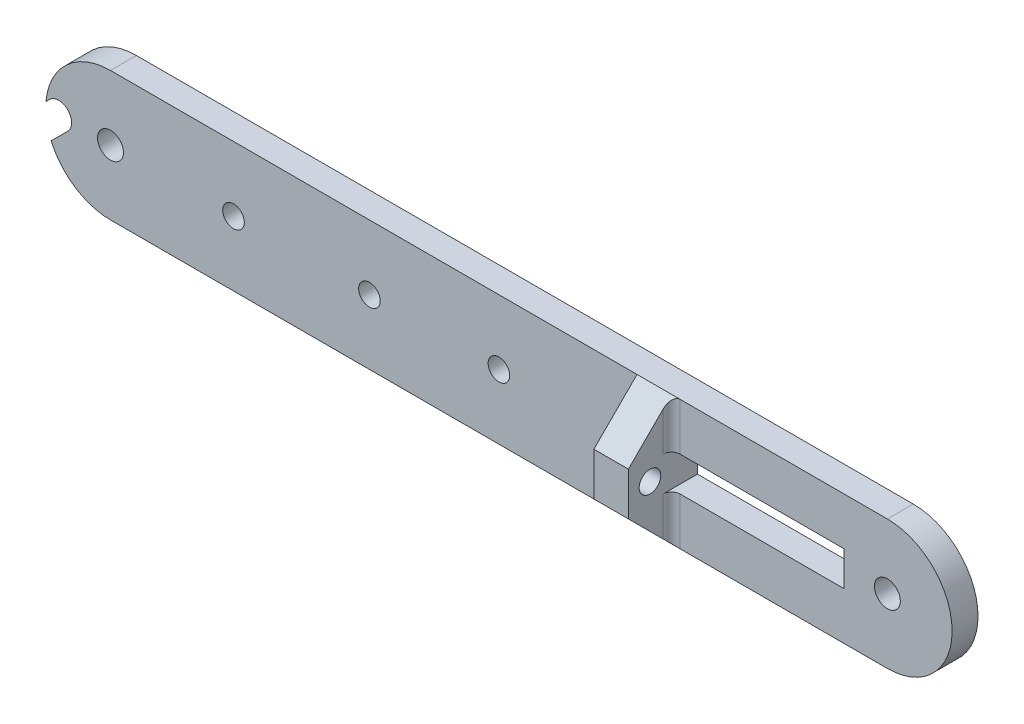
ISO-10303-21;
HEADER;
FILE_DESCRIPTION(('STEP AP214'),'2;1');
FILE_NAME('part.step','',(''),(''),'','','');
FILE_SCHEMA(('AUTOMOTIVE_DESIGN { 1 0 10303 214 1 1 1 1 }'));
ENDSEC;
DATA;
#1=APPLICATION_CONTEXT('core data for automotive mechanical design processes');
#2=APPLICATION_PROTOCOL_DEFINITION('international standard','automotive_design',2000,#1);
#3=PRODUCT_CONTEXT('',#1,'mechanical');
#4=PRODUCT('Part','Part','',(#3));
#5=PRODUCT_RELATED_PRODUCT_CATEGORY('part','',(#4));
#6=PRODUCT_DEFINITION_FORMATION('','',#4);
#7=PRODUCT_DEFINITION_CONTEXT('part definition',#1,'design');
#8=PRODUCT_DEFINITION('design','',#6,#7);
#9=PRODUCT_DEFINITION_SHAPE('','',#8);
#10=(LENGTH_UNIT() NAMED_UNIT(*) SI_UNIT(.MILLI.,.METRE.));
#11=(NAMED_UNIT(*) PLANE_ANGLE_UNIT() SI_UNIT($,.RADIAN.));
#12=(NAMED_UNIT(*) SI_UNIT($,.STERADIAN.) SOLID_ANGLE_UNIT());
#13=UNCERTAINTY_MEASURE_WITH_UNIT(LENGTH_MEASURE(1.E-05),#10,'distance_accuracy_value','');
#14=(GEOMETRIC_REPRESENTATION_CONTEXT(3) GLOBAL_UNCERTAINTY_ASSIGNED_CONTEXT((#13)) GLOBAL_UNIT_ASSIGNED_CONTEXT((#10,
#11,#12)) REPRESENTATION_CONTEXT('',''));
#15=CARTESIAN_POINT('',(0.,0.,0.));
#16=DIRECTION('',(0.,0.,1.));
#17=DIRECTION('',(1.,0.,0.));
#18=AXIS2_PLACEMENT_3D('',#15,#16,#17);
#19=CARTESIAN_POINT('',(90.,0.,6.));
#20=DIRECTION('',(0.,0.,1.));
#21=DIRECTION('',(1.,0.,0.));
#22=AXIS2_PLACEMENT_3D('',#19,#20,#21);
#23=PLANE('',#22);
#24=CARTESIAN_POINT('',(-30.,0.,6.));
#25=DIRECTION('',(0.,0.,1.));
#26=DIRECTION('',(1.,0.,0.));
#27=AXIS2_PLACEMENT_3D('',#24,#25,#26);
#28=CIRCLE('',#27,2.5);
#29=CARTESIAN_POINT('',(-27.5,0.,6.));
#30=VERTEX_POINT('',#29);
#31=EDGE_CURVE('E381',#30,#30,#28,.T.);
#32=ORIENTED_EDGE('',*,*,#31,.F.);
#33=EDGE_LOOP('',(#32));
#34=FACE_BOUND('',#33,.T.);
#35=CARTESIAN_POINT('',(-90.,0.,6.));
#36=DIRECTION('',(0.,0.,1.));
#37=DIRECTION('',(-1.,0.,0.));
#38=AXIS2_PLACEMENT_3D('',#35,#36,#37);
#39=CIRCLE('',#38,3.00000000000001);
#40=CARTESIAN_POINT('',(-93.,0.,6.));
#41=VERTEX_POINT('',#40);
#42=EDGE_CURVE('E393',#41,#41,#39,.T.);
#43=ORIENTED_EDGE('',*,*,#42,.F.);
#44=EDGE_LOOP('',(#43));
#45=FACE_BOUND('',#44,.T.);
#46=CARTESIAN_POINT('',(0.,0.,6.));
#47=DIRECTION('',(0.,0.,1.));
#48=DIRECTION('',(1.,0.,0.));
#49=AXIS2_PLACEMENT_3D('',#46,#47,#48);
#50=CIRCLE('',#49,2.5);
#51=CARTESIAN_POINT('',(2.5,0.,6.));
#52=VERTEX_POINT('',#51);
#53=EDGE_CURVE('E424',#52,#52,#50,.T.);
#54=ORIENTED_EDGE('',*,*,#53,.F.);
#55=EDGE_LOOP('',(#54));
#56=FACE_BOUND('',#55,.T.);
#57=CARTESIAN_POINT('',(-61.5,0.,6.));
#58=DIRECTION('',(0.,0.,1.));
#59=DIRECTION('',(1.,0.,0.));
#60=AXIS2_PLACEMENT_3D('',#57,#58,#59);
#61=CIRCLE('',#60,2.50000000000001);
#62=CARTESIAN_POINT('',(-59.,0.,6.));
#63=VERTEX_POINT('',#62);
#64=EDGE_CURVE('E387',#63,#63,#61,.T.);
#65=ORIENTED_EDGE('',*,*,#64,.F.);
#66=EDGE_LOOP('',(#65));
#67=FACE_BOUND('',#66,.T.);
#68=CARTESIAN_POINT('',(-102.,0.,6.));
#69=DIRECTION('',(0.,0.,1.));
#70=DIRECTION('',(1.,0.,0.));
#71=AXIS2_PLACEMENT_3D('',#68,#69,#70);
#72=CIRCLE('',#71,3.00000000000001);
#73=CARTESIAN_POINT('',(-99.8786796564403,-2.12132034355963,6.));
#74=VERTEX_POINT('',#73);
#75=CARTESIAN_POINT('',(-104.12132034356,2.12132034355962,6.));
#76=VERTEX_POINT('',#75);
#77=EDGE_CURVE('E199',#74,#76,#72,.T.);
#78=ORIENTED_EDGE('',*,*,#77,.F.);
#79=DIRECTION('',(-0.707106781186543,-0.707106781186552,0.));
#80=VECTOR('',#79,1.);
#81=CARTESIAN_POINT('',(-48.878679656441,48.8786796564403,6.));
#82=LINE('',#81,#80);
#83=CARTESIAN_POINT('',(-103.750652312537,-5.99329299965612,6.));
#84=VERTEX_POINT('',#83);
#85=EDGE_CURVE('E205',#74,#84,#82,.T.);
#86=ORIENTED_EDGE('',*,*,#85,.T.);
#87=CARTESIAN_POINT('',(-90.,0.,6.));
#88=DIRECTION('',(0.,0.,1.));
#89=DIRECTION('',(-1.,0.,0.));
#90=AXIS2_PLACEMENT_3D('',#87,#88,#89);
#91=CIRCLE('',#90,15.);
#92=CARTESIAN_POINT('',(-90.,-15.,6.));
#93=VERTEX_POINT('',#92);
#94=EDGE_CURVE('E349',#84,#93,#91,.T.);
#95=ORIENTED_EDGE('',*,*,#94,.T.);
#96=DIRECTION('',(1.,0.,0.));
#97=VECTOR('',#96,1.);
#98=CARTESIAN_POINT('',(90.,-15.,6.));
#99=LINE('',#98,#97);
#100=CARTESIAN_POINT('',(32.,-15.,6.));
#101=VERTEX_POINT('',#100);
#102=EDGE_CURVE('E351',#93,#101,#99,.T.);
#103=ORIENTED_EDGE('',*,*,#102,.T.);
#104=DIRECTION('',(0.,1.,0.));
#105=VECTOR('',#104,1.);
#106=CARTESIAN_POINT('',(32.,-15.,6.));
#107=LINE('',#106,#105);
#108=CARTESIAN_POINT('',(32.,15.,6.));
#109=VERTEX_POINT('',#108);
#110=EDGE_CURVE('E277',#101,#109,#107,.T.);
#111=ORIENTED_EDGE('',*,*,#110,.T.);
#112=DIRECTION('',(-1.,0.,0.));
#113=VECTOR('',#112,1.);
#114=CARTESIAN_POINT('',(90.,15.,6.));
#115=LINE('',#114,#113);
#116=CARTESIAN_POINT('',(-90.,15.,6.));
#117=VERTEX_POINT('',#116);
#118=EDGE_CURVE('E347',#109,#117,#115,.T.);
#119=ORIENTED_EDGE('',*,*,#118,.T.);
#120=CARTESIAN_POINT('',(-104.943648089812,1.29899259730734,6.));
#121=VERTEX_POINT('',#120);
#122=EDGE_CURVE('E343',#117,#121,#91,.T.);
#123=ORIENTED_EDGE('',*,*,#122,.T.);
#124=DIRECTION('',(-0.707106781186544,-0.707106781186552,0.));
#125=VECTOR('',#124,1.);
#126=CARTESIAN_POINT('',(-53.1213203435602,53.1213203435596,6.));
#127=LINE('',#126,#125);
#128=EDGE_CURVE('E48',#76,#121,#127,.T.);
#129=ORIENTED_EDGE('',*,*,#128,.F.);
#130=EDGE_LOOP('',(#78,#86,#95,#103,#111,#119,#123,#129));
#131=FACE_BOUND('',#130,.T.);
#132=ADVANCED_FACE('F33',(#34,#45,#56,#67,#131),#23,.T.);
#133=CARTESIAN_POINT('',(90.,0.,0.));
#134=DIRECTION('',(0.,0.,1.));
#135=DIRECTION('',(1.,0.,0.));
#136=AXIS2_PLACEMENT_3D('',#133,#134,#135);
#137=PLANE('',#136);
#138=CARTESIAN_POINT('',(-30.,0.,0.));
#139=DIRECTION('',(0.,0.,1.));
#140=DIRECTION('',(1.,0.,0.));
#141=AXIS2_PLACEMENT_3D('',#138,#139,#140);
#142=CIRCLE('',#141,2.5);
#143=CARTESIAN_POINT('',(-27.5,0.,0.));
#144=VERTEX_POINT('',#143);
#145=EDGE_CURVE('E287',#144,#144,#142,.T.);
#146=ORIENTED_EDGE('',*,*,#145,.T.);
#147=EDGE_LOOP('',(#146));
#148=FACE_BOUND('',#147,.T.);
#149=CARTESIAN_POINT('',(-61.5,0.,0.));
#150=DIRECTION('',(0.,0.,1.));
#151=DIRECTION('',(1.,0.,0.));
#152=AXIS2_PLACEMENT_3D('',#149,#150,#151);
#153=CIRCLE('',#152,2.50000000000001);
#154=CARTESIAN_POINT('',(-59.,0.,0.));
#155=VERTEX_POINT('',#154);
#156=EDGE_CURVE('E384',#155,#155,#153,.T.);
#157=ORIENTED_EDGE('',*,*,#156,.T.);
#158=EDGE_LOOP('',(#157));
#159=FACE_BOUND('',#158,.T.);
#160=CARTESIAN_POINT('',(-90.,0.,0.));
#161=DIRECTION('',(0.,0.,1.));
#162=DIRECTION('',(-1.,0.,0.));
#163=AXIS2_PLACEMENT_3D('',#160,#161,#162);
#164=CIRCLE('',#163,3.00000000000001);
#165=CARTESIAN_POINT('',(-93.,0.,0.));
#166=VERTEX_POINT('',#165);
#167=EDGE_CURVE('E390',#166,#166,#164,.T.);
#168=ORIENTED_EDGE('',*,*,#167,.T.);
#169=EDGE_LOOP('',(#168));
#170=FACE_BOUND('',#169,.T.);
#171=DIRECTION('',(0.,1.,0.));
#172=VECTOR('',#171,1.);
#173=CARTESIAN_POINT('',(80.,-4.,0.));
#174=LINE('',#173,#172);
#175=CARTESIAN_POINT('',(80.,-4.,0.));
#176=VERTEX_POINT('',#175);
#177=CARTESIAN_POINT('',(80.,4.,0.));
#178=VERTEX_POINT('',#177);
#179=EDGE_CURVE('E396',#176,#178,#174,.T.);
#180=ORIENTED_EDGE('',*,*,#179,.T.);
#181=DIRECTION('',(-1.,0.,0.));
#182=VECTOR('',#181,1.);
#183=CARTESIAN_POINT('',(40.,4.,0.));
#184=LINE('',#183,#182);
#185=CARTESIAN_POINT('',(40.,4.,0.));
#186=VERTEX_POINT('',#185);
#187=EDGE_CURVE('E404',#178,#186,#184,.T.);
#188=ORIENTED_EDGE('',*,*,#187,.T.);
#189=DIRECTION('',(0.,-1.,0.));
#190=VECTOR('',#189,1.);
#191=CARTESIAN_POINT('',(40.,-4.,0.));
#192=LINE('',#191,#190);
#193=CARTESIAN_POINT('',(40.,-4.,0.));
#194=VERTEX_POINT('',#193);
#195=EDGE_CURVE('E407',#186,#194,#192,.T.);
#196=ORIENTED_EDGE('',*,*,#195,.T.);
#197=DIRECTION('',(1.,0.,0.));
#198=VECTOR('',#197,1.);
#199=CARTESIAN_POINT('',(40.,-4.,0.));
#200=LINE('',#199,#198);
#201=EDGE_CURVE('E401',#194,#176,#200,.T.);
#202=ORIENTED_EDGE('',*,*,#201,.T.);
#203=EDGE_LOOP('',(#180,#188,#196,#202));
#204=FACE_BOUND('',#203,.T.);
#205=CARTESIAN_POINT('',(0.,0.,0.));
#206=DIRECTION('',(0.,0.,1.));
#207=DIRECTION('',(1.,0.,0.));
#208=AXIS2_PLACEMENT_3D('',#205,#206,#207);
#209=CIRCLE('',#208,2.5);
#210=CARTESIAN_POINT('',(2.5,0.,0.));
#211=VERTEX_POINT('',#210);
#212=EDGE_CURVE('E421',#211,#211,#209,.T.);
#213=ORIENTED_EDGE('',*,*,#212,.T.);
#214=EDGE_LOOP('',(#213));
#215=FACE_BOUND('',#214,.T.);
#216=CARTESIAN_POINT('',(90.,0.,0.));
#217=DIRECTION('',(0.,0.,1.));
#218=DIRECTION('',(1.,0.,0.));
#219=AXIS2_PLACEMENT_3D('',#216,#217,#218);
#220=CIRCLE('',#219,3.00000000000001);
#221=CARTESIAN_POINT('',(93.,0.,0.));
#222=VERTEX_POINT('',#221);
#223=EDGE_CURVE('E417',#222,#222,#220,.T.);
#224=ORIENTED_EDGE('',*,*,#223,.T.);
#225=EDGE_LOOP('',(#224));
#226=FACE_BOUND('',#225,.T.);
#227=DIRECTION('',(-0.707106781186543,-0.707106781186552,0.));
#228=VECTOR('',#227,1.);
#229=CARTESIAN_POINT('',(-3.87867965644158,93.8786796564403,0.));
#230=LINE('',#229,#228);
#231=CARTESIAN_POINT('',(-99.8786796564403,-2.12132034355963,0.));
#232=VERTEX_POINT('',#231);
#233=CARTESIAN_POINT('',(-103.750652312537,-5.99329299965612,0.));
#234=VERTEX_POINT('',#233);
#235=EDGE_CURVE('E219',#232,#234,#230,.T.);
#236=ORIENTED_EDGE('',*,*,#235,.F.);
#237=CARTESIAN_POINT('',(-102.,0.,0.));
#238=DIRECTION('',(0.,0.,1.));
#239=DIRECTION('',(1.,0.,0.));
#240=AXIS2_PLACEMENT_3D('',#237,#238,#239);
#241=CIRCLE('',#240,3.00000000000001);
#242=CARTESIAN_POINT('',(-104.12132034356,2.12132034355962,0.));
#243=VERTEX_POINT('',#242);
#244=EDGE_CURVE('E11',#232,#243,#241,.T.);
#245=ORIENTED_EDGE('',*,*,#244,.T.);
#246=DIRECTION('',(-0.707106781186544,-0.707106781186552,0.));
#247=VECTOR('',#246,1.);
#248=CARTESIAN_POINT('',(-8.12132034356074,98.1213203435596,0.));
#249=LINE('',#248,#247);
#250=CARTESIAN_POINT('',(-104.943648089812,1.29899259730734,0.));
#251=VERTEX_POINT('',#250);
#252=EDGE_CURVE('E215',#243,#251,#249,.T.);
#253=ORIENTED_EDGE('',*,*,#252,.T.);
#254=CARTESIAN_POINT('',(-90.,0.,0.));
#255=DIRECTION('',(0.,0.,1.));
#256=DIRECTION('',(-1.,0.,0.));
#257=AXIS2_PLACEMENT_3D('',#254,#255,#256);
#258=CIRCLE('',#257,15.);
#259=CARTESIAN_POINT('',(-90.,15.,0.));
#260=VERTEX_POINT('',#259);
#261=EDGE_CURVE('E345',#260,#251,#258,.T.);
#262=ORIENTED_EDGE('',*,*,#261,.F.);
#263=DIRECTION('',(-1.,0.,0.));
#264=VECTOR('',#263,1.);
#265=CARTESIAN_POINT('',(90.,15.,0.));
#266=LINE('',#265,#264);
#267=CARTESIAN_POINT('',(90.,15.,0.));
#268=VERTEX_POINT('',#267);
#269=EDGE_CURVE('E495',#268,#260,#266,.T.);
#270=ORIENTED_EDGE('',*,*,#269,.F.);
#271=CARTESIAN_POINT('',(90.,0.,0.));
#272=DIRECTION('',(0.,0.,1.));
#273=DIRECTION('',(1.,0.,0.));
#274=AXIS2_PLACEMENT_3D('',#271,#272,#273);
#275=CIRCLE('',#274,15.);
#276=CARTESIAN_POINT('',(90.,-15.,0.));
#277=VERTEX_POINT('',#276);
#278=EDGE_CURVE('E358',#277,#268,#275,.T.);
#279=ORIENTED_EDGE('',*,*,#278,.F.);
#280=DIRECTION('',(1.,0.,0.));
#281=VECTOR('',#280,1.);
#282=CARTESIAN_POINT('',(90.,-15.,0.));
#283=LINE('',#282,#281);
#284=CARTESIAN_POINT('',(-90.,-15.,0.));
#285=VERTEX_POINT('',#284);
#286=EDGE_CURVE('E430',#285,#277,#283,.T.);
#287=ORIENTED_EDGE('',*,*,#286,.F.);
#288=EDGE_CURVE('E440',#234,#285,#258,.T.);
#289=ORIENTED_EDGE('',*,*,#288,.F.);
#290=EDGE_LOOP('',(#236,#245,#253,#262,#270,#279,#287,#289));
#291=FACE_BOUND('',#290,.T.);
#292=ADVANCED_FACE('F476',(#148,#159,#170,#204,#215,#226,#291),#137,.F.);
#293=CARTESIAN_POINT('',(-90.,0.,6.));
#294=DIRECTION('',(0.,0.,-1.));
#295=DIRECTION('',(-1.,0.,0.));
#296=AXIS2_PLACEMENT_3D('',#293,#294,#295);
#297=CYLINDRICAL_SURFACE('',#296,15.);
#298=DIRECTION('',(0.,0.,-1.));
#299=VECTOR('',#298,1.);
#300=CARTESIAN_POINT('',(-103.750652312537,-5.99329299965612,6.));
#301=LINE('',#300,#299);
#302=EDGE_CURVE('E41',#234,#84,#301,.F.);
#303=ORIENTED_EDGE('',*,*,#302,.F.);
#304=ORIENTED_EDGE('',*,*,#288,.T.);
#305=DIRECTION('',(0.,0.,-1.));
#306=VECTOR('',#305,1.);
#307=CARTESIAN_POINT('',(-90.,-15.,6.));
#308=LINE('',#307,#306);
#309=EDGE_CURVE('E444',#93,#285,#308,.T.);
#310=ORIENTED_EDGE('',*,*,#309,.F.);
#311=ORIENTED_EDGE('',*,*,#94,.F.);
#312=EDGE_LOOP('',(#303,#304,#310,#311));
#313=FACE_BOUND('',#312,.T.);
#314=ADVANCED_FACE('F511',(#313),#297,.T.);
#315=CARTESIAN_POINT('',(90.,15.,6.));
#316=VERTEX_POINT('',#315);
#317=CARTESIAN_POINT('',(42.,15.,6.));
#318=VERTEX_POINT('',#317);
#319=EDGE_CURVE('E352',#316,#318,#115,.T.);
#320=ORIENTED_EDGE('',*,*,#319,.T.);
#321=DIRECTION('',(0.,1.,0.));
#322=VECTOR('',#321,1.);
#323=CARTESIAN_POINT('',(42.,4.,6.));
#324=LINE('',#323,#322);
#325=CARTESIAN_POINT('',(42.,4.,6.));
#326=VERTEX_POINT('',#325);
#327=EDGE_CURVE('E322',#318,#326,#324,.F.);
#328=ORIENTED_EDGE('',*,*,#327,.T.);
#329=DIRECTION('',(-1.,0.,0.));
#330=VECTOR('',#329,1.);
#331=CARTESIAN_POINT('',(40.,4.,6.));
#332=LINE('',#331,#330);
#333=CARTESIAN_POINT('',(80.,4.,6.));
#334=VERTEX_POINT('',#333);
#335=EDGE_CURVE('E310',#334,#326,#332,.T.);
#336=ORIENTED_EDGE('',*,*,#335,.F.);
#337=DIRECTION('',(0.,1.,0.));
#338=VECTOR('',#337,1.);
#339=CARTESIAN_POINT('',(80.,-4.,6.));
#340=LINE('',#339,#338);
#341=CARTESIAN_POINT('',(80.,-4.,6.));
#342=VERTEX_POINT('',#341);
#343=EDGE_CURVE('E399',#342,#334,#340,.T.);
#344=ORIENTED_EDGE('',*,*,#343,.F.);
#345=DIRECTION('',(1.,0.,0.));
#346=VECTOR('',#345,1.);
#347=CARTESIAN_POINT('',(40.,-4.,6.));
#348=LINE('',#347,#346);
#349=CARTESIAN_POINT('',(42.,-4.,6.));
#350=VERTEX_POINT('',#349);
#351=EDGE_CURVE('E313',#350,#342,#348,.T.);
#352=ORIENTED_EDGE('',*,*,#351,.F.);
#353=DIRECTION('',(0.,1.,0.));
#354=VECTOR('',#353,1.);
#355=CARTESIAN_POINT('',(42.,-15.,6.));
#356=LINE('',#355,#354);
#357=CARTESIAN_POINT('',(42.,-15.,6.));
#358=VERTEX_POINT('',#357);
#359=EDGE_CURVE('E319',#350,#358,#356,.F.);
#360=ORIENTED_EDGE('',*,*,#359,.T.);
#361=CARTESIAN_POINT('',(90.,-15.,6.));
#362=VERTEX_POINT('',#361);
#363=EDGE_CURVE('E316',#358,#362,#99,.T.);
#364=ORIENTED_EDGE('',*,*,#363,.T.);
#365=CARTESIAN_POINT('',(90.,0.,6.));
#366=DIRECTION('',(0.,0.,1.));
#367=DIRECTION('',(1.,0.,0.));
#368=AXIS2_PLACEMENT_3D('',#365,#366,#367);
#369=CIRCLE('',#368,15.);
#370=EDGE_CURVE('E428',#362,#316,#369,.T.);
#371=ORIENTED_EDGE('',*,*,#370,.T.);
#372=EDGE_LOOP('',(#320,#328,#336,#344,#352,#360,#364,#371));
#373=FACE_BOUND('',#372,.T.);
#374=CARTESIAN_POINT('',(90.,0.,6.));
#375=DIRECTION('',(0.,0.,1.));
#376=DIRECTION('',(1.,0.,0.));
#377=AXIS2_PLACEMENT_3D('',#374,#375,#376);
#378=CIRCLE('',#377,3.00000000000001);
#379=CARTESIAN_POINT('',(93.,0.,6.));
#380=VERTEX_POINT('',#379);
#381=EDGE_CURVE('E418',#380,#380,#378,.T.);
#382=ORIENTED_EDGE('',*,*,#381,.F.);
#383=EDGE_LOOP('',(#382));
#384=FACE_BOUND('',#383,.T.);
#385=ADVANCED_FACE('F451',(#373,#384),#23,.T.);
#386=CARTESIAN_POINT('',(90.,0.,6.));
#387=DIRECTION('',(0.,0.,-1.));
#388=DIRECTION('',(-1.,0.,0.));
#389=AXIS2_PLACEMENT_3D('',#386,#387,#388);
#390=CYLINDRICAL_SURFACE('',#389,15.);
#391=ORIENTED_EDGE('',*,*,#278,.T.);
#392=DIRECTION('',(0.,0.,-1.));
#393=VECTOR('',#392,1.);
#394=CARTESIAN_POINT('',(90.,15.,6.));
#395=LINE('',#394,#393);
#396=EDGE_CURVE('E448',#316,#268,#395,.T.);
#397=ORIENTED_EDGE('',*,*,#396,.F.);
#398=ORIENTED_EDGE('',*,*,#370,.F.);
#399=DIRECTION('',(0.,0.,-1.));
#400=VECTOR('',#399,1.);
#401=CARTESIAN_POINT('',(90.,-15.,6.));
#402=LINE('',#401,#400);
#403=EDGE_CURVE('E365',#362,#277,#402,.T.);
#404=ORIENTED_EDGE('',*,*,#403,.T.);
#405=EDGE_LOOP('',(#391,#397,#398,#404));
#406=FACE_BOUND('',#405,.T.);
#407=ADVANCED_FACE('F493',(#406),#390,.T.);
#408=CARTESIAN_POINT('',(90.,15.,6.));
#409=DIRECTION('',(0.,-1.,0.));
#410=DIRECTION('',(0.,0.,-1.));
#411=AXIS2_PLACEMENT_3D('',#408,#409,#410);
#412=PLANE('',#411);
#413=ORIENTED_EDGE('',*,*,#269,.T.);
#414=DIRECTION('',(0.,0.,-1.));
#415=VECTOR('',#414,1.);
#416=CARTESIAN_POINT('',(-90.,15.,6.));
#417=LINE('',#416,#415);
#418=EDGE_CURVE('E446',#117,#260,#417,.T.);
#419=ORIENTED_EDGE('',*,*,#418,.F.);
#420=ORIENTED_EDGE('',*,*,#118,.F.);
#421=DIRECTION('',(1.,0.,0.));
#422=VECTOR('',#421,1.);
#423=CARTESIAN_POINT('',(32.,15.,6.));
#424=LINE('',#423,#422);
#425=EDGE_CURVE('E294',#109,#318,#424,.T.);
#426=ORIENTED_EDGE('',*,*,#425,.T.);
#427=ORIENTED_EDGE('',*,*,#319,.F.);
#428=ORIENTED_EDGE('',*,*,#396,.T.);
#429=EDGE_LOOP('',(#413,#419,#420,#426,#427,#428));
#430=FACE_BOUND('',#429,.T.);
#431=ADVANCED_FACE('F494',(#430),#412,.F.);
#432=ORIENTED_EDGE('',*,*,#261,.T.);
#433=DIRECTION('',(0.,0.,-1.));
#434=VECTOR('',#433,1.);
#435=CARTESIAN_POINT('',(-104.943648089812,1.29899259730734,6.));
#436=LINE('',#435,#434);
#437=EDGE_CURVE('E335',#251,#121,#436,.F.);
#438=ORIENTED_EDGE('',*,*,#437,.T.);
#439=ORIENTED_EDGE('',*,*,#122,.F.);
#440=ORIENTED_EDGE('',*,*,#418,.T.);
#441=EDGE_LOOP('',(#432,#438,#439,#440));
#442=FACE_BOUND('',#441,.T.);
#443=ADVANCED_FACE('F341',(#442),#297,.T.);
#444=CARTESIAN_POINT('',(90.,-15.,6.));
#445=DIRECTION('',(0.,1.,0.));
#446=DIRECTION('',(0.,0.,1.));
#447=AXIS2_PLACEMENT_3D('',#444,#445,#446);
#448=PLANE('',#447);
#449=ORIENTED_EDGE('',*,*,#286,.T.);
#450=ORIENTED_EDGE('',*,*,#403,.F.);
#451=ORIENTED_EDGE('',*,*,#363,.F.);
#452=DIRECTION('',(1.,0.,0.));
#453=VECTOR('',#452,1.);
#454=CARTESIAN_POINT('',(32.,-15.,6.));
#455=LINE('',#454,#453);
#456=EDGE_CURVE('E285',#101,#358,#455,.T.);
#457=ORIENTED_EDGE('',*,*,#456,.F.);
#458=ORIENTED_EDGE('',*,*,#102,.F.);
#459=ORIENTED_EDGE('',*,*,#309,.T.);
#460=EDGE_LOOP('',(#449,#450,#451,#457,#458,#459));
#461=FACE_BOUND('',#460,.T.);
#462=ADVANCED_FACE('F488',(#461),#448,.F.);
#463=CARTESIAN_POINT('',(0.,0.,6.));
#464=DIRECTION('',(0.,0.,-1.));
#465=DIRECTION('',(-1.,0.,0.));
#466=AXIS2_PLACEMENT_3D('',#463,#464,#465);
#467=CYLINDRICAL_SURFACE('',#466,2.5);
#468=ORIENTED_EDGE('',*,*,#53,.T.);
#469=EDGE_LOOP('',(#468));
#470=FACE_BOUND('',#469,.T.);
#471=ORIENTED_EDGE('',*,*,#212,.F.);
#472=EDGE_LOOP('',(#471));
#473=FACE_BOUND('',#472,.T.);
#474=ADVANCED_FACE('F534',(#470,#473),#467,.F.);
#475=CARTESIAN_POINT('',(90.,0.,6.));
#476=DIRECTION('',(0.,0.,-1.));
#477=DIRECTION('',(-1.,0.,0.));
#478=AXIS2_PLACEMENT_3D('',#475,#476,#477);
#479=CYLINDRICAL_SURFACE('',#478,3.00000000000001);
#480=ORIENTED_EDGE('',*,*,#381,.T.);
#481=EDGE_LOOP('',(#480));
#482=FACE_BOUND('',#481,.T.);
#483=ORIENTED_EDGE('',*,*,#223,.F.);
#484=EDGE_LOOP('',(#483));
#485=FACE_BOUND('',#484,.T.);
#486=ADVANCED_FACE('F587',(#482,#485),#479,.F.);
#487=CARTESIAN_POINT('',(80.,-4.,6.));
#488=DIRECTION('',(-1.,0.,0.));
#489=DIRECTION('',(0.,0.,1.));
#490=AXIS2_PLACEMENT_3D('',#487,#488,#489);
#491=PLANE('',#490);
#492=ORIENTED_EDGE('',*,*,#179,.F.);
#493=DIRECTION('',(0.,0.,-1.));
#494=VECTOR('',#493,1.);
#495=CARTESIAN_POINT('',(80.,-4.,6.));
#496=LINE('',#495,#494);
#497=EDGE_CURVE('E305',#342,#176,#496,.T.);
#498=ORIENTED_EDGE('',*,*,#497,.F.);
#499=ORIENTED_EDGE('',*,*,#343,.T.);
#500=DIRECTION('',(0.,0.,-1.));
#501=VECTOR('',#500,1.);
#502=CARTESIAN_POINT('',(80.,4.,6.));
#503=LINE('',#502,#501);
#504=EDGE_CURVE('E414',#334,#178,#503,.T.);
#505=ORIENTED_EDGE('',*,*,#504,.T.);
#506=EDGE_LOOP('',(#492,#498,#499,#505));
#507=FACE_BOUND('',#506,.T.);
#508=ADVANCED_FACE('F471',(#507),#491,.T.);
#509=CARTESIAN_POINT('',(40.,4.,6.));
#510=DIRECTION('',(0.,-1.,0.));
#511=DIRECTION('',(0.,0.,-1.));
#512=AXIS2_PLACEMENT_3D('',#509,#510,#511);
#513=PLANE('',#512);
#514=ORIENTED_EDGE('',*,*,#187,.F.);
#515=ORIENTED_EDGE('',*,*,#504,.F.);
#516=ORIENTED_EDGE('',*,*,#335,.T.);
#517=CARTESIAN_POINT('',(42.,4.,8.));
#518=DIRECTION('',(0.,-1.,0.));
#519=DIRECTION('',(0.,0.,-1.));
#520=AXIS2_PLACEMENT_3D('',#517,#518,#519);
#521=CIRCLE('',#520,2.);
#522=CARTESIAN_POINT('',(40.,4.,8.));
#523=VERTEX_POINT('',#522);
#524=EDGE_CURVE('E328',#326,#523,#521,.F.);
#525=ORIENTED_EDGE('',*,*,#524,.T.);
#526=DIRECTION('',(0.,0.,-1.));
#527=VECTOR('',#526,1.);
#528=CARTESIAN_POINT('',(40.,4.,6.));
#529=LINE('',#528,#527);
#530=EDGE_CURVE('E304',#523,#186,#529,.T.);
#531=ORIENTED_EDGE('',*,*,#530,.T.);
#532=EDGE_LOOP('',(#514,#515,#516,#525,#531));
#533=FACE_BOUND('',#532,.T.);
#534=ADVANCED_FACE('F463',(#533),#513,.T.);
#535=CARTESIAN_POINT('',(40.,-4.,6.));
#536=DIRECTION('',(1.,0.,0.));
#537=DIRECTION('',(0.,0.,-1.));
#538=AXIS2_PLACEMENT_3D('',#535,#536,#537);
#539=PLANE('',#538);
#540=ORIENTED_EDGE('',*,*,#530,.F.);
#541=DIRECTION('',(0.,1.,0.));
#542=VECTOR('',#541,1.);
#543=CARTESIAN_POINT('',(40.,15.,8.));
#544=LINE('',#543,#542);
#545=CARTESIAN_POINT('',(40.,13.,8.));
#546=VERTEX_POINT('',#545);
#547=EDGE_CURVE('E323',#523,#546,#544,.T.);
#548=ORIENTED_EDGE('',*,*,#547,.T.);
#549=DIRECTION('',(0.,-0.707106781186548,0.707106781186548));
#550=VECTOR('',#549,1.);
#551=CARTESIAN_POINT('',(40.,15.,6.));
#552=LINE('',#551,#550);
#553=CARTESIAN_POINT('',(40.,5.,16.));
#554=VERTEX_POINT('',#553);
#555=EDGE_CURVE('E271',#546,#554,#552,.T.);
#556=ORIENTED_EDGE('',*,*,#555,.T.);
#557=DIRECTION('',(0.,-1.,0.));
#558=VECTOR('',#557,1.);
#559=CARTESIAN_POINT('',(40.,5.,16.));
#560=LINE('',#559,#558);
#561=CARTESIAN_POINT('',(40.,-5.,16.));
#562=VERTEX_POINT('',#561);
#563=EDGE_CURVE('E299',#554,#562,#560,.T.);
#564=ORIENTED_EDGE('',*,*,#563,.T.);
#565=DIRECTION('',(0.,-0.707106781186547,-0.707106781186548));
#566=VECTOR('',#565,1.);
#567=CARTESIAN_POINT('',(40.,-15.,6.));
#568=LINE('',#567,#566);
#569=CARTESIAN_POINT('',(40.,-13.,8.));
#570=VERTEX_POINT('',#569);
#571=EDGE_CURVE('E282',#562,#570,#568,.T.);
#572=ORIENTED_EDGE('',*,*,#571,.T.);
#573=DIRECTION('',(0.,1.,0.));
#574=VECTOR('',#573,1.);
#575=CARTESIAN_POINT('',(40.,-4.,8.));
#576=LINE('',#575,#574);
#577=CARTESIAN_POINT('',(40.,-4.,8.));
#578=VERTEX_POINT('',#577);
#579=EDGE_CURVE('E450',#570,#578,#576,.T.);
#580=ORIENTED_EDGE('',*,*,#579,.T.);
#581=DIRECTION('',(0.,0.,-1.));
#582=VECTOR('',#581,1.);
#583=CARTESIAN_POINT('',(40.,-4.,6.));
#584=LINE('',#583,#582);
#585=EDGE_CURVE('E302',#578,#194,#584,.T.);
#586=ORIENTED_EDGE('',*,*,#585,.T.);
#587=ORIENTED_EDGE('',*,*,#195,.F.);
#588=EDGE_LOOP('',(#540,#548,#556,#564,#572,#580,#586,#587));
#589=FACE_BOUND('',#588,.T.);
#590=CARTESIAN_POINT('',(40.,0.,11.));
#591=DIRECTION('',(1.,0.,0.));
#592=DIRECTION('',(0.,0.,-1.));
#593=AXIS2_PLACEMENT_3D('',#590,#591,#592);
#594=CIRCLE('',#593,2.5);
#595=CARTESIAN_POINT('',(40.,0.,8.5));
#596=VERTEX_POINT('',#595);
#597=EDGE_CURVE('E268',#596,#596,#594,.T.);
#598=ORIENTED_EDGE('',*,*,#597,.F.);
#599=EDGE_LOOP('',(#598));
#600=FACE_BOUND('',#599,.T.);
#601=ADVANCED_FACE('F479',(#589,#600),#539,.T.);
#602=CARTESIAN_POINT('',(40.,-4.,6.));
#603=DIRECTION('',(0.,1.,0.));
#604=DIRECTION('',(0.,0.,1.));
#605=AXIS2_PLACEMENT_3D('',#602,#603,#604);
#606=PLANE('',#605);
#607=ORIENTED_EDGE('',*,*,#201,.F.);
#608=ORIENTED_EDGE('',*,*,#585,.F.);
#609=CARTESIAN_POINT('',(42.,-4.,8.));
#610=DIRECTION('',(0.,1.,0.));
#611=DIRECTION('',(0.,0.,1.));
#612=AXIS2_PLACEMENT_3D('',#609,#610,#611);
#613=CIRCLE('',#612,2.);
#614=EDGE_CURVE('E331',#578,#350,#613,.F.);
#615=ORIENTED_EDGE('',*,*,#614,.T.);
#616=ORIENTED_EDGE('',*,*,#351,.T.);
#617=ORIENTED_EDGE('',*,*,#497,.T.);
#618=EDGE_LOOP('',(#607,#608,#615,#616,#617));
#619=FACE_BOUND('',#618,.T.);
#620=ADVANCED_FACE('F474',(#619),#606,.T.);
#621=CARTESIAN_POINT('',(-90.,0.,6.));
#622=DIRECTION('',(0.,0.,-1.));
#623=DIRECTION('',(-1.,0.,0.));
#624=AXIS2_PLACEMENT_3D('',#621,#622,#623);
#625=CYLINDRICAL_SURFACE('',#624,3.00000000000001);
#626=ORIENTED_EDGE('',*,*,#42,.T.);
#627=EDGE_LOOP('',(#626));
#628=FACE_BOUND('',#627,.T.);
#629=ORIENTED_EDGE('',*,*,#167,.F.);
#630=EDGE_LOOP('',(#629));
#631=FACE_BOUND('',#630,.T.);
#632=ADVANCED_FACE('F574',(#628,#631),#625,.F.);
#633=CARTESIAN_POINT('',(-61.5,0.,6.));
#634=DIRECTION('',(0.,0.,-1.));
#635=DIRECTION('',(-1.,0.,0.));
#636=AXIS2_PLACEMENT_3D('',#633,#634,#635);
#637=CYLINDRICAL_SURFACE('',#636,2.50000000000001);
#638=ORIENTED_EDGE('',*,*,#64,.T.);
#639=EDGE_LOOP('',(#638));
#640=FACE_BOUND('',#639,.T.);
#641=ORIENTED_EDGE('',*,*,#156,.F.);
#642=EDGE_LOOP('',(#641));
#643=FACE_BOUND('',#642,.T.);
#644=ADVANCED_FACE('F570',(#640,#643),#637,.F.);
#645=CARTESIAN_POINT('',(-30.,0.,6.));
#646=DIRECTION('',(0.,0.,-1.));
#647=DIRECTION('',(-1.,0.,0.));
#648=AXIS2_PLACEMENT_3D('',#645,#646,#647);
#649=CYLINDRICAL_SURFACE('',#648,2.5);
#650=ORIENTED_EDGE('',*,*,#31,.T.);
#651=EDGE_LOOP('',(#650));
#652=FACE_BOUND('',#651,.T.);
#653=ORIENTED_EDGE('',*,*,#145,.F.);
#654=EDGE_LOOP('',(#653));
#655=FACE_BOUND('',#654,.T.);
#656=ADVANCED_FACE('F561',(#652,#655),#649,.F.);
#657=CARTESIAN_POINT('',(32.,-15.,6.));
#658=DIRECTION('',(0.,-0.707106781186548,0.707106781186547));
#659=DIRECTION('',(0.,-0.707106781186547,-0.707106781186548));
#660=AXIS2_PLACEMENT_3D('',#657,#658,#659);
#661=PLANE('',#660);
#662=ORIENTED_EDGE('',*,*,#571,.F.);
#663=DIRECTION('',(1.,0.,0.));
#664=VECTOR('',#663,1.);
#665=CARTESIAN_POINT('',(32.,-5.,16.));
#666=LINE('',#665,#664);
#667=CARTESIAN_POINT('',(32.,-5.,16.));
#668=VERTEX_POINT('',#667);
#669=EDGE_CURVE('E288',#668,#562,#666,.T.);
#670=ORIENTED_EDGE('',*,*,#669,.F.);
#671=DIRECTION('',(0.,-0.707106781186547,-0.707106781186548));
#672=VECTOR('',#671,1.);
#673=CARTESIAN_POINT('',(32.,-15.,6.));
#674=LINE('',#673,#672);
#675=EDGE_CURVE('E291',#668,#101,#674,.T.);
#676=ORIENTED_EDGE('',*,*,#675,.T.);
#677=ORIENTED_EDGE('',*,*,#456,.T.);
#678=CARTESIAN_POINT('',(42.,-13.,8.));
#679=DIRECTION('',(0.,-0.707106781186548,0.707106781186547));
#680=DIRECTION('',(0.,-0.707106781186547,-0.707106781186548));
#681=AXIS2_PLACEMENT_3D('',#678,#679,#680);
#682=ELLIPSE('',#681,2.82842712474619,2.);
#683=EDGE_CURVE('E333',#358,#570,#682,.F.);
#684=ORIENTED_EDGE('',*,*,#683,.T.);
#685=EDGE_LOOP('',(#662,#670,#676,#677,#684));
#686=FACE_BOUND('',#685,.T.);
#687=ADVANCED_FACE('F557',(#686),#661,.T.);
#688=CARTESIAN_POINT('',(32.,5.,16.));
#689=DIRECTION('',(0.,0.,1.));
#690=DIRECTION('',(1.,0.,0.));
#691=AXIS2_PLACEMENT_3D('',#688,#689,#690);
#692=PLANE('',#691);
#693=ORIENTED_EDGE('',*,*,#563,.F.);
#694=DIRECTION('',(1.,0.,0.));
#695=VECTOR('',#694,1.);
#696=CARTESIAN_POINT('',(32.,5.,16.));
#697=LINE('',#696,#695);
#698=CARTESIAN_POINT('',(32.,5.,16.));
#699=VERTEX_POINT('',#698);
#700=EDGE_CURVE('E370',#699,#554,#697,.T.);
#701=ORIENTED_EDGE('',*,*,#700,.F.);
#702=DIRECTION('',(0.,-1.,0.));
#703=VECTOR('',#702,1.);
#704=CARTESIAN_POINT('',(32.,5.,16.));
#705=LINE('',#704,#703);
#706=EDGE_CURVE('E274',#699,#668,#705,.T.);
#707=ORIENTED_EDGE('',*,*,#706,.T.);
#708=ORIENTED_EDGE('',*,*,#669,.T.);
#709=EDGE_LOOP('',(#693,#701,#707,#708));
#710=FACE_BOUND('',#709,.T.);
#711=ADVANCED_FACE('F560',(#710),#692,.T.);
#712=CARTESIAN_POINT('',(32.,15.,6.));
#713=DIRECTION('',(0.,0.707106781186547,0.707106781186547));
#714=DIRECTION('',(0.,-0.707106781186548,0.707106781186548));
#715=AXIS2_PLACEMENT_3D('',#712,#713,#714);
#716=PLANE('',#715);
#717=ORIENTED_EDGE('',*,*,#555,.F.);
#718=CARTESIAN_POINT('',(42.,13.,8.));
#719=DIRECTION('',(0.,0.707106781186547,0.707106781186547));
#720=DIRECTION('',(0.,-0.707106781186548,0.707106781186548));
#721=AXIS2_PLACEMENT_3D('',#718,#719,#720);
#722=ELLIPSE('',#721,2.82842712474619,2.);
#723=EDGE_CURVE('E325',#546,#318,#722,.F.);
#724=ORIENTED_EDGE('',*,*,#723,.T.);
#725=ORIENTED_EDGE('',*,*,#425,.F.);
#726=DIRECTION('',(0.,-0.707106781186548,0.707106781186548));
#727=VECTOR('',#726,1.);
#728=CARTESIAN_POINT('',(32.,15.,6.));
#729=LINE('',#728,#727);
#730=EDGE_CURVE('E281',#109,#699,#729,.T.);
#731=ORIENTED_EDGE('',*,*,#730,.T.);
#732=ORIENTED_EDGE('',*,*,#700,.T.);
#733=EDGE_LOOP('',(#717,#724,#725,#731,#732));
#734=FACE_BOUND('',#733,.T.);
#735=ADVANCED_FACE('F456',(#734),#716,.T.);
#736=CARTESIAN_POINT('',(32.,0.,0.));
#737=DIRECTION('',(1.,0.,0.));
#738=DIRECTION('',(0.,0.,-1.));
#739=AXIS2_PLACEMENT_3D('',#736,#737,#738);
#740=PLANE('',#739);
#741=DIRECTION('',(0.,0.500000000000001,-0.866025403784438));
#742=VECTOR('',#741,1.);
#743=CARTESIAN_POINT('',(32.,4.,11.));
#744=LINE('',#743,#742);
#745=CARTESIAN_POINT('',(32.,1.99999999999999,14.4641016151378));
#746=VERTEX_POINT('',#745);
#747=CARTESIAN_POINT('',(32.,4.,11.));
#748=VERTEX_POINT('',#747);
#749=EDGE_CURVE('E242',#746,#748,#744,.T.);
#750=ORIENTED_EDGE('',*,*,#749,.F.);
#751=DIRECTION('',(0.,1.,0.));
#752=VECTOR('',#751,1.);
#753=CARTESIAN_POINT('',(32.,1.99999999999999,14.4641016151378));
#754=LINE('',#753,#752);
#755=CARTESIAN_POINT('',(32.,-2.00000000000002,14.4641016151377));
#756=VERTEX_POINT('',#755);
#757=EDGE_CURVE('E56',#756,#746,#754,.T.);
#758=ORIENTED_EDGE('',*,*,#757,.F.);
#759=DIRECTION('',(0.,0.499999999999998,0.86602540378444));
#760=VECTOR('',#759,1.);
#761=CARTESIAN_POINT('',(32.,-2.00000000000002,14.4641016151377));
#762=LINE('',#761,#760);
#763=CARTESIAN_POINT('',(32.,-4.,11.));
#764=VERTEX_POINT('',#763);
#765=EDGE_CURVE('E225',#764,#756,#762,.T.);
#766=ORIENTED_EDGE('',*,*,#765,.F.);
#767=DIRECTION('',(0.,-0.499999999999998,0.86602540378444));
#768=VECTOR('',#767,1.);
#769=CARTESIAN_POINT('',(32.,-2.00000000000002,7.53589838486225));
#770=LINE('',#769,#768);
#771=CARTESIAN_POINT('',(32.,-2.00000000000002,7.53589838486225));
#772=VERTEX_POINT('',#771);
#773=EDGE_CURVE('E251',#772,#764,#770,.T.);
#774=ORIENTED_EDGE('',*,*,#773,.F.);
#775=DIRECTION('',(0.,-1.,0.));
#776=VECTOR('',#775,1.);
#777=CARTESIAN_POINT('',(32.,1.99999999999999,7.53589838486224));
#778=LINE('',#777,#776);
#779=CARTESIAN_POINT('',(32.,1.99999999999999,7.53589838486224));
#780=VERTEX_POINT('',#779);
#781=EDGE_CURVE('E248',#780,#772,#778,.T.);
#782=ORIENTED_EDGE('',*,*,#781,.F.);
#783=DIRECTION('',(0.,-0.500000000000001,-0.866025403784438));
#784=VECTOR('',#783,1.);
#785=CARTESIAN_POINT('',(32.,4.,11.));
#786=LINE('',#785,#784);
#787=EDGE_CURVE('E245',#748,#780,#786,.T.);
#788=ORIENTED_EDGE('',*,*,#787,.F.);
#789=EDGE_LOOP('',(#750,#758,#766,#774,#782,#788));
#790=FACE_BOUND('',#789,.T.);
#791=ORIENTED_EDGE('',*,*,#110,.F.);
#792=ORIENTED_EDGE('',*,*,#675,.F.);
#793=ORIENTED_EDGE('',*,*,#706,.F.);
#794=ORIENTED_EDGE('',*,*,#730,.F.);
#795=EDGE_LOOP('',(#791,#792,#793,#794));
#796=FACE_BOUND('',#795,.T.);
#797=ADVANCED_FACE('F544',(#790,#796),#740,.F.);
#798=CARTESIAN_POINT('',(32.,0.,11.));
#799=DIRECTION('',(1.,0.,0.));
#800=DIRECTION('',(0.,0.,-1.));
#801=AXIS2_PLACEMENT_3D('',#798,#799,#800);
#802=CYLINDRICAL_SURFACE('',#801,2.5);
#803=CARTESIAN_POINT('',(36.,0.,11.));
#804=DIRECTION('',(1.,0.,0.));
#805=DIRECTION('',(0.,0.,-1.));
#806=AXIS2_PLACEMENT_3D('',#803,#804,#805);
#807=CIRCLE('',#806,2.5);
#808=CARTESIAN_POINT('',(36.,0.,8.5));
#809=VERTEX_POINT('',#808);
#810=EDGE_CURVE('E258',#809,#809,#807,.F.);
#811=ORIENTED_EDGE('',*,*,#810,.T.);
#812=EDGE_LOOP('',(#811));
#813=FACE_BOUND('',#812,.T.);
#814=ORIENTED_EDGE('',*,*,#597,.T.);
#815=EDGE_LOOP('',(#814));
#816=FACE_BOUND('',#815,.T.);
#817=ADVANCED_FACE('F538',(#813,#816),#802,.F.);
#818=CARTESIAN_POINT('',(42.,-4.,8.));
#819=DIRECTION('',(0.,-1.,0.));
#820=DIRECTION('',(0.,0.,-1.));
#821=AXIS2_PLACEMENT_3D('',#818,#819,#820);
#822=CYLINDRICAL_SURFACE('',#821,2.);
#823=ORIENTED_EDGE('',*,*,#524,.F.);
#824=ORIENTED_EDGE('',*,*,#327,.F.);
#825=ORIENTED_EDGE('',*,*,#723,.F.);
#826=ORIENTED_EDGE('',*,*,#547,.F.);
#827=EDGE_LOOP('',(#823,#824,#825,#826));
#828=FACE_BOUND('',#827,.T.);
#829=ADVANCED_FACE('F461',(#828),#822,.F.);
#830=CARTESIAN_POINT('',(42.,-4.,8.));
#831=DIRECTION('',(0.,-1.,0.));
#832=DIRECTION('',(0.,0.,-1.));
#833=AXIS2_PLACEMENT_3D('',#830,#831,#832);
#834=CYLINDRICAL_SURFACE('',#833,2.);
#835=ORIENTED_EDGE('',*,*,#683,.F.);
#836=ORIENTED_EDGE('',*,*,#359,.F.);
#837=ORIENTED_EDGE('',*,*,#614,.F.);
#838=ORIENTED_EDGE('',*,*,#579,.F.);
#839=EDGE_LOOP('',(#835,#836,#837,#838));
#840=FACE_BOUND('',#839,.T.);
#841=ADVANCED_FACE('F35',(#840),#834,.F.);
#842=CARTESIAN_POINT('',(36.,0.,0.));
#843=DIRECTION('',(1.,0.,0.));
#844=DIRECTION('',(0.,0.,-1.));
#845=AXIS2_PLACEMENT_3D('',#842,#843,#844);
#846=PLANE('',#845);
#847=DIRECTION('',(0.,1.,0.));
#848=VECTOR('',#847,1.);
#849=CARTESIAN_POINT('',(36.,1.99999999999999,14.4641016151378));
#850=LINE('',#849,#848);
#851=CARTESIAN_POINT('',(36.,-2.00000000000002,14.4641016151377));
#852=VERTEX_POINT('',#851);
#853=CARTESIAN_POINT('',(36.,1.99999999999999,14.4641016151378));
#854=VERTEX_POINT('',#853);
#855=EDGE_CURVE('E221',#852,#854,#850,.T.);
#856=ORIENTED_EDGE('',*,*,#855,.T.);
#857=DIRECTION('',(0.,0.500000000000001,-0.866025403784438));
#858=VECTOR('',#857,1.);
#859=CARTESIAN_POINT('',(36.,4.,11.));
#860=LINE('',#859,#858);
#861=CARTESIAN_POINT('',(36.,4.,11.));
#862=VERTEX_POINT('',#861);
#863=EDGE_CURVE('E224',#854,#862,#860,.T.);
#864=ORIENTED_EDGE('',*,*,#863,.T.);
#865=DIRECTION('',(0.,-0.500000000000001,-0.866025403784438));
#866=VECTOR('',#865,1.);
#867=CARTESIAN_POINT('',(36.,4.,11.));
#868=LINE('',#867,#866);
#869=CARTESIAN_POINT('',(36.,1.99999999999999,7.53589838486224));
#870=VERTEX_POINT('',#869);
#871=EDGE_CURVE('E228',#862,#870,#868,.T.);
#872=ORIENTED_EDGE('',*,*,#871,.T.);
#873=DIRECTION('',(0.,-1.,0.));
#874=VECTOR('',#873,1.);
#875=CARTESIAN_POINT('',(36.,1.99999999999999,7.53589838486224));
#876=LINE('',#875,#874);
#877=CARTESIAN_POINT('',(36.,-2.00000000000002,7.53589838486225));
#878=VERTEX_POINT('',#877);
#879=EDGE_CURVE('E231',#870,#878,#876,.T.);
#880=ORIENTED_EDGE('',*,*,#879,.T.);
#881=DIRECTION('',(0.,-0.499999999999998,0.86602540378444));
#882=VECTOR('',#881,1.);
#883=CARTESIAN_POINT('',(36.,-2.00000000000002,7.53589838486225));
#884=LINE('',#883,#882);
#885=CARTESIAN_POINT('',(36.,-4.,11.));
#886=VERTEX_POINT('',#885);
#887=EDGE_CURVE('E234',#878,#886,#884,.T.);
#888=ORIENTED_EDGE('',*,*,#887,.T.);
#889=DIRECTION('',(0.,0.499999999999998,0.86602540378444));
#890=VECTOR('',#889,1.);
#891=CARTESIAN_POINT('',(36.,-2.00000000000002,14.4641016151377));
#892=LINE('',#891,#890);
#893=EDGE_CURVE('E237',#886,#852,#892,.T.);
#894=ORIENTED_EDGE('',*,*,#893,.T.);
#895=EDGE_LOOP('',(#856,#864,#872,#880,#888,#894));
#896=FACE_BOUND('',#895,.T.);
#897=ORIENTED_EDGE('',*,*,#810,.F.);
#898=EDGE_LOOP('',(#897));
#899=FACE_BOUND('',#898,.T.);
#900=ADVANCED_FACE('F543',(#896,#899),#846,.F.);
#901=CARTESIAN_POINT('',(36.,1.99999999999999,14.4641016151378));
#902=DIRECTION('',(0.,0.,1.));
#903=DIRECTION('',(0.,-1.,0.));
#904=AXIS2_PLACEMENT_3D('',#901,#902,#903);
#905=PLANE('',#904);
#906=ORIENTED_EDGE('',*,*,#757,.T.);
#907=DIRECTION('',(-1.,0.,0.));
#908=VECTOR('',#907,1.);
#909=CARTESIAN_POINT('',(36.,1.99999999999999,14.4641016151378));
#910=LINE('',#909,#908);
#911=EDGE_CURVE('E240',#854,#746,#910,.T.);
#912=ORIENTED_EDGE('',*,*,#911,.F.);
#913=ORIENTED_EDGE('',*,*,#855,.F.);
#914=DIRECTION('',(-1.,0.,0.));
#915=VECTOR('',#914,1.);
#916=CARTESIAN_POINT('',(36.,-2.00000000000002,14.4641016151377));
#917=LINE('',#916,#915);
#918=EDGE_CURVE('E256',#852,#756,#917,.T.);
#919=ORIENTED_EDGE('',*,*,#918,.T.);
#920=EDGE_LOOP('',(#906,#912,#913,#919));
#921=FACE_BOUND('',#920,.T.);
#922=ADVANCED_FACE('F554',(#921),#905,.F.);
#923=CARTESIAN_POINT('',(36.,-2.00000000000002,14.4641016151377));
#924=DIRECTION('',(0.,-0.86602540378444,0.499999999999998));
#925=DIRECTION('',(0.,-0.499999999999998,-0.86602540378444));
#926=AXIS2_PLACEMENT_3D('',#923,#924,#925);
#927=PLANE('',#926);
#928=ORIENTED_EDGE('',*,*,#765,.T.);
#929=ORIENTED_EDGE('',*,*,#918,.F.);
#930=ORIENTED_EDGE('',*,*,#893,.F.);
#931=DIRECTION('',(-1.,0.,0.));
#932=VECTOR('',#931,1.);
#933=CARTESIAN_POINT('',(36.,-4.,11.));
#934=LINE('',#933,#932);
#935=EDGE_CURVE('E259',#886,#764,#934,.T.);
#936=ORIENTED_EDGE('',*,*,#935,.T.);
#937=EDGE_LOOP('',(#928,#929,#930,#936));
#938=FACE_BOUND('',#937,.T.);
#939=ADVANCED_FACE('F686',(#938),#927,.F.);
#940=CARTESIAN_POINT('',(36.,-2.00000000000002,7.53589838486225));
#941=DIRECTION('',(0.,-0.86602540378444,-0.499999999999998));
#942=DIRECTION('',(0.,0.499999999999998,-0.86602540378444));
#943=AXIS2_PLACEMENT_3D('',#940,#941,#942);
#944=PLANE('',#943);
#945=ORIENTED_EDGE('',*,*,#773,.T.);
#946=ORIENTED_EDGE('',*,*,#935,.F.);
#947=ORIENTED_EDGE('',*,*,#887,.F.);
#948=DIRECTION('',(-1.,0.,0.));
#949=VECTOR('',#948,1.);
#950=CARTESIAN_POINT('',(36.,-2.00000000000002,7.53589838486225));
#951=LINE('',#950,#949);
#952=EDGE_CURVE('E261',#878,#772,#951,.T.);
#953=ORIENTED_EDGE('',*,*,#952,.T.);
#954=EDGE_LOOP('',(#945,#946,#947,#953));
#955=FACE_BOUND('',#954,.T.);
#956=ADVANCED_FACE('F694',(#955),#944,.F.);
#957=CARTESIAN_POINT('',(36.,1.99999999999999,7.53589838486224));
#958=DIRECTION('',(0.,0.,-1.));
#959=DIRECTION('',(0.,1.,0.));
#960=AXIS2_PLACEMENT_3D('',#957,#958,#959);
#961=PLANE('',#960);
#962=ORIENTED_EDGE('',*,*,#781,.T.);
#963=ORIENTED_EDGE('',*,*,#952,.F.);
#964=ORIENTED_EDGE('',*,*,#879,.F.);
#965=DIRECTION('',(-1.,0.,0.));
#966=VECTOR('',#965,1.);
#967=CARTESIAN_POINT('',(36.,1.99999999999999,7.53589838486224));
#968=LINE('',#967,#966);
#969=EDGE_CURVE('E263',#870,#780,#968,.T.);
#970=ORIENTED_EDGE('',*,*,#969,.T.);
#971=EDGE_LOOP('',(#962,#963,#964,#970));
#972=FACE_BOUND('',#971,.T.);
#973=ADVANCED_FACE('F704',(#972),#961,.F.);
#974=CARTESIAN_POINT('',(36.,4.,11.));
#975=DIRECTION('',(0.,0.866025403784438,-0.500000000000001));
#976=DIRECTION('',(0.,0.500000000000001,0.866025403784438));
#977=AXIS2_PLACEMENT_3D('',#974,#975,#976);
#978=PLANE('',#977);
#979=ORIENTED_EDGE('',*,*,#787,.T.);
#980=ORIENTED_EDGE('',*,*,#969,.F.);
#981=ORIENTED_EDGE('',*,*,#871,.F.);
#982=DIRECTION('',(-1.,0.,0.));
#983=VECTOR('',#982,1.);
#984=CARTESIAN_POINT('',(36.,4.,11.));
#985=LINE('',#984,#983);
#986=EDGE_CURVE('E265',#862,#748,#985,.T.);
#987=ORIENTED_EDGE('',*,*,#986,.T.);
#988=EDGE_LOOP('',(#979,#980,#981,#987));
#989=FACE_BOUND('',#988,.T.);
#990=ADVANCED_FACE('F714',(#989),#978,.F.);
#991=CARTESIAN_POINT('',(36.,4.,11.));
#992=DIRECTION('',(0.,0.866025403784438,0.500000000000001));
#993=DIRECTION('',(0.,-0.500000000000001,0.866025403784438));
#994=AXIS2_PLACEMENT_3D('',#991,#992,#993);
#995=PLANE('',#994);
#996=ORIENTED_EDGE('',*,*,#749,.T.);
#997=ORIENTED_EDGE('',*,*,#986,.F.);
#998=ORIENTED_EDGE('',*,*,#863,.F.);
#999=ORIENTED_EDGE('',*,*,#911,.T.);
#1000=EDGE_LOOP('',(#996,#997,#998,#999));
#1001=FACE_BOUND('',#1000,.T.);
#1002=ADVANCED_FACE('F724',(#1001),#995,.F.);
#1003=CARTESIAN_POINT('',(-102.,0.,-4.));
#1004=DIRECTION('',(0.,0.,1.));
#1005=DIRECTION('',(1.,0.,0.));
#1006=AXIS2_PLACEMENT_3D('',#1003,#1004,#1005);
#1007=CYLINDRICAL_SURFACE('',#1006,3.00000000000001);
#1008=DIRECTION('',(0.,0.,1.));
#1009=VECTOR('',#1008,1.);
#1010=CARTESIAN_POINT('',(-99.8786796564403,-2.12132034355963,-4.));
#1011=LINE('',#1010,#1009);
#1012=EDGE_CURVE('E194',#232,#74,#1011,.T.);
#1013=ORIENTED_EDGE('',*,*,#1012,.T.);
#1014=ORIENTED_EDGE('',*,*,#77,.T.);
#1015=DIRECTION('',(0.,0.,1.));
#1016=VECTOR('',#1015,1.);
#1017=CARTESIAN_POINT('',(-104.12132034356,2.12132034355962,-4.));
#1018=LINE('',#1017,#1016);
#1019=EDGE_CURVE('E202',#243,#76,#1018,.T.);
#1020=ORIENTED_EDGE('',*,*,#1019,.F.);
#1021=ORIENTED_EDGE('',*,*,#244,.F.);
#1022=EDGE_LOOP('',(#1013,#1014,#1020,#1021));
#1023=FACE_BOUND('',#1022,.T.);
#1024=ADVANCED_FACE('F196',(#1023),#1007,.F.);
#1025=CARTESIAN_POINT('',(-48.878679656441,48.8786796564403,-4.));
#1026=DIRECTION('',(-0.707106781186552,0.707106781186543,0.));
#1027=DIRECTION('',(-0.707106781186543,-0.707106781186552,0.));
#1028=AXIS2_PLACEMENT_3D('',#1025,#1026,#1027);
#1029=PLANE('',#1028);
#1030=ORIENTED_EDGE('',*,*,#235,.T.);
#1031=ORIENTED_EDGE('',*,*,#302,.T.);
#1032=ORIENTED_EDGE('',*,*,#85,.F.);
#1033=ORIENTED_EDGE('',*,*,#1012,.F.);
#1034=EDGE_LOOP('',(#1030,#1031,#1032,#1033));
#1035=FACE_BOUND('',#1034,.T.);
#1036=ADVANCED_FACE('F206',(#1035),#1029,.T.);
#1037=CARTESIAN_POINT('',(-53.1213203435602,53.1213203435596,-4.));
#1038=DIRECTION('',(-0.707106781186552,0.707106781186544,0.));
#1039=DIRECTION('',(-0.707106781186544,-0.707106781186552,0.));
#1040=AXIS2_PLACEMENT_3D('',#1037,#1038,#1039);
#1041=PLANE('',#1040);
#1042=ORIENTED_EDGE('',*,*,#1019,.T.);
#1043=ORIENTED_EDGE('',*,*,#128,.T.);
#1044=ORIENTED_EDGE('',*,*,#437,.F.);
#1045=ORIENTED_EDGE('',*,*,#252,.F.);
#1046=EDGE_LOOP('',(#1042,#1043,#1044,#1045));
#1047=FACE_BOUND('',#1046,.T.);
#1048=ADVANCED_FACE('F497',(#1047),#1041,.F.);
#1049=CLOSED_SHELL('',(#132,#292,#314,#385,#407,#431,#443,#462,#474,#486,#508,#534,#601,#620,
#632,#644,#656,#687,#711,#735,#797,#817,#829,#841,#900,#922,#939,#956,#973,#990,#1002,#1024,
#1036,#1048));
#1050=MANIFOLD_SOLID_BREP('B2',#1049);
#1051=ADVANCED_BREP_SHAPE_REPRESENTATION('',(#18,#1050),#14);
#1052=SHAPE_DEFINITION_REPRESENTATION(#9,#1051);
ENDSEC;
END-ISO-10303-21;
